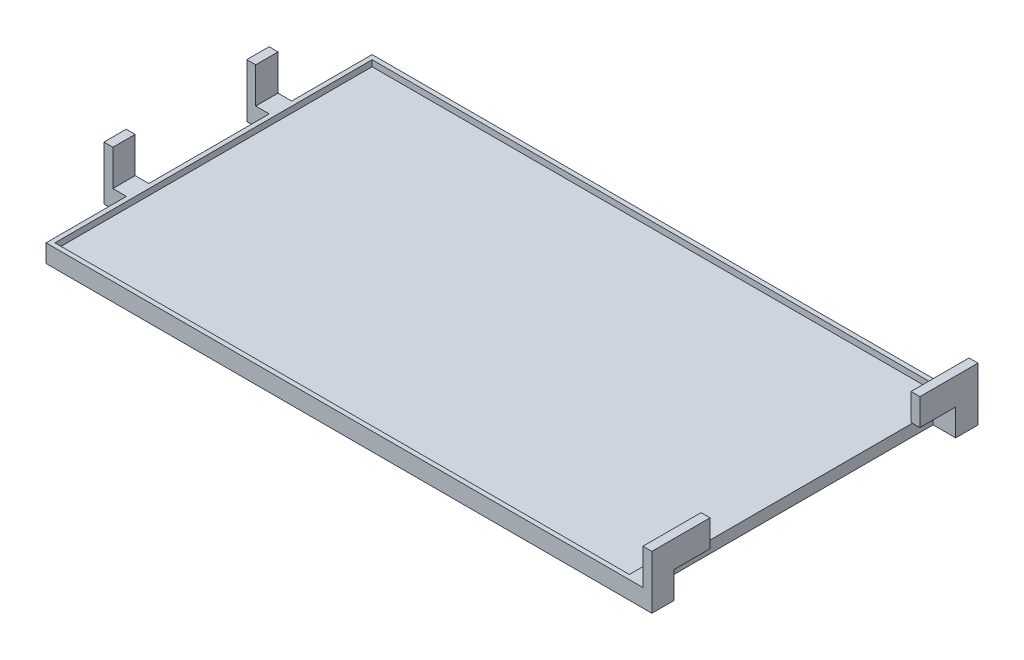
ISO-10303-21;
HEADER;
FILE_DESCRIPTION(('STEP AP214'),'2;1');
FILE_NAME('part.step','',(''),(''),'','','');
FILE_SCHEMA(('AUTOMOTIVE_DESIGN { 1 0 10303 214 1 1 1 1 }'));
ENDSEC;
DATA;
#1=APPLICATION_CONTEXT('core data for automotive mechanical design processes');
#2=APPLICATION_PROTOCOL_DEFINITION('international standard','automotive_design',2000,#1);
#3=PRODUCT_CONTEXT('',#1,'mechanical');
#4=PRODUCT('Part','Part','',(#3));
#5=PRODUCT_RELATED_PRODUCT_CATEGORY('part','',(#4));
#6=PRODUCT_DEFINITION_FORMATION('','',#4);
#7=PRODUCT_DEFINITION_CONTEXT('part definition',#1,'design');
#8=PRODUCT_DEFINITION('design','',#6,#7);
#9=PRODUCT_DEFINITION_SHAPE('','',#8);
#10=(LENGTH_UNIT() NAMED_UNIT(*) SI_UNIT(.MILLI.,.METRE.));
#11=(NAMED_UNIT(*) PLANE_ANGLE_UNIT() SI_UNIT($,.RADIAN.));
#12=(NAMED_UNIT(*) SI_UNIT($,.STERADIAN.) SOLID_ANGLE_UNIT());
#13=UNCERTAINTY_MEASURE_WITH_UNIT(LENGTH_MEASURE(1.E-05),#10,'distance_accuracy_value','');
#14=(GEOMETRIC_REPRESENTATION_CONTEXT(3) GLOBAL_UNCERTAINTY_ASSIGNED_CONTEXT((#13)) GLOBAL_UNIT_ASSIGNED_CONTEXT((#10,
#11,#12)) REPRESENTATION_CONTEXT('',''));
#15=CARTESIAN_POINT('',(0.,0.,0.));
#16=DIRECTION('',(0.,0.,1.));
#17=DIRECTION('',(1.,0.,0.));
#18=AXIS2_PLACEMENT_3D('',#15,#16,#17);
#19=CARTESIAN_POINT('',(0.,4.,0.));
#20=DIRECTION('',(0.,-1.,0.));
#21=DIRECTION('',(0.,0.,-1.));
#22=AXIS2_PLACEMENT_3D('',#19,#20,#21);
#23=PLANE('',#22);
#24=DIRECTION('',(0.,0.,-1.));
#25=VECTOR('',#24,1.);
#26=CARTESIAN_POINT('',(-3.045005,4.,-18.));
#27=LINE('',#26,#25);
#28=CARTESIAN_POINT('',(-3.045005,4.,-18.));
#29=VERTEX_POINT('',#28);
#30=CARTESIAN_POINT('',(-3.045005,4.,-23.));
#31=VERTEX_POINT('',#30);
#32=EDGE_CURVE('E295',#29,#31,#27,.T.);
#33=ORIENTED_EDGE('',*,*,#32,.F.);
#34=DIRECTION('',(-1.,0.,0.));
#35=VECTOR('',#34,1.);
#36=CARTESIAN_POINT('',(0.,4.,-18.));
#37=LINE('',#36,#35);
#38=CARTESIAN_POINT('',(0.,4.,-18.));
#39=VERTEX_POINT('',#38);
#40=EDGE_CURVE('E322',#39,#29,#37,.T.);
#41=ORIENTED_EDGE('',*,*,#40,.F.);
#42=DIRECTION('',(0.,0.,1.));
#43=VECTOR('',#42,1.);
#44=CARTESIAN_POINT('',(0.,4.,0.));
#45=LINE('',#44,#43);
#46=CARTESIAN_POINT('',(0.,4.,0.));
#47=VERTEX_POINT('',#46);
#48=EDGE_CURVE('E48',#39,#47,#45,.T.);
#49=ORIENTED_EDGE('',*,*,#48,.T.);
#50=DIRECTION('',(1.,0.,0.));
#51=VECTOR('',#50,1.);
#52=CARTESIAN_POINT('',(0.,4.,0.));
#53=LINE('',#52,#51);
#54=CARTESIAN_POINT('',(133.555005,4.,0.));
#55=VERTEX_POINT('',#54);
#56=EDGE_CURVE('E517',#47,#55,#53,.T.);
#57=ORIENTED_EDGE('',*,*,#56,.T.);
#58=DIRECTION('',(0.,0.,1.));
#59=VECTOR('',#58,1.);
#60=CARTESIAN_POINT('',(133.555005,4.,-5.));
#61=LINE('',#60,#59);
#62=CARTESIAN_POINT('',(133.555005,4.,-5.));
#63=VERTEX_POINT('',#62);
#64=EDGE_CURVE('E393',#63,#55,#61,.T.);
#65=ORIENTED_EDGE('',*,*,#64,.F.);
#66=DIRECTION('',(1.,0.,0.));
#67=VECTOR('',#66,1.);
#68=CARTESIAN_POINT('',(130.51,4.,-5.));
#69=LINE('',#68,#67);
#70=CARTESIAN_POINT('',(130.51,4.,-5.));
#71=VERTEX_POINT('',#70);
#72=EDGE_CURVE('E423',#71,#63,#69,.T.);
#73=ORIENTED_EDGE('',*,*,#72,.F.);
#74=DIRECTION('',(0.,0.,-1.));
#75=VECTOR('',#74,1.);
#76=CARTESIAN_POINT('',(130.51,4.,0.));
#77=LINE('',#76,#75);
#78=CARTESIAN_POINT('',(130.51,4.,-6.));
#79=VERTEX_POINT('',#78);
#80=EDGE_CURVE('E522',#71,#79,#77,.T.);
#81=ORIENTED_EDGE('',*,*,#80,.T.);
#82=DIRECTION('',(-1.,0.,0.));
#83=VECTOR('',#82,1.);
#84=CARTESIAN_POINT('',(130.51,4.,-6.));
#85=LINE('',#84,#83);
#86=CARTESIAN_POINT('',(129.51,4.,-6.));
#87=VERTEX_POINT('',#86);
#88=EDGE_CURVE('E472',#79,#87,#85,.T.);
#89=ORIENTED_EDGE('',*,*,#88,.T.);
#90=DIRECTION('',(0.,0.,-1.));
#91=VECTOR('',#90,1.);
#92=CARTESIAN_POINT('',(129.51,4.,-1.));
#93=LINE('',#92,#91);
#94=CARTESIAN_POINT('',(129.51,4.,-1.));
#95=VERTEX_POINT('',#94);
#96=EDGE_CURVE('E483',#95,#87,#93,.T.);
#97=ORIENTED_EDGE('',*,*,#96,.F.);
#98=DIRECTION('',(1.,0.,0.));
#99=VECTOR('',#98,1.);
#100=CARTESIAN_POINT('',(1.,4.,-1.));
#101=LINE('',#100,#99);
#102=CARTESIAN_POINT('',(1.,4.,-1.));
#103=VERTEX_POINT('',#102);
#104=EDGE_CURVE('E498',#103,#95,#101,.T.);
#105=ORIENTED_EDGE('',*,*,#104,.F.);
#106=DIRECTION('',(0.,0.,1.));
#107=VECTOR('',#106,1.);
#108=CARTESIAN_POINT('',(1.,4.,-71.96));
#109=LINE('',#108,#107);
#110=CARTESIAN_POINT('',(1.,4.,-71.96));
#111=VERTEX_POINT('',#110);
#112=EDGE_CURVE('E495',#111,#103,#109,.T.);
#113=ORIENTED_EDGE('',*,*,#112,.F.);
#114=DIRECTION('',(-1.,0.,0.));
#115=VECTOR('',#114,1.);
#116=CARTESIAN_POINT('',(129.51,4.,-71.96));
#117=LINE('',#116,#115);
#118=CARTESIAN_POINT('',(129.51,4.,-71.96));
#119=VERTEX_POINT('',#118);
#120=EDGE_CURVE('E471',#119,#111,#117,.T.);
#121=ORIENTED_EDGE('',*,*,#120,.F.);
#122=CARTESIAN_POINT('',(129.51,4.,-66.96));
#123=VERTEX_POINT('',#122);
#124=EDGE_CURVE('E501',#123,#119,#93,.T.);
#125=ORIENTED_EDGE('',*,*,#124,.F.);
#126=DIRECTION('',(-1.,0.,0.));
#127=VECTOR('',#126,1.);
#128=CARTESIAN_POINT('',(130.51,4.,-66.96));
#129=LINE('',#128,#127);
#130=CARTESIAN_POINT('',(130.51,4.,-66.96));
#131=VERTEX_POINT('',#130);
#132=EDGE_CURVE('E469',#131,#123,#129,.T.);
#133=ORIENTED_EDGE('',*,*,#132,.F.);
#134=CARTESIAN_POINT('',(130.51,4.,-67.96));
#135=VERTEX_POINT('',#134);
#136=EDGE_CURVE('E521',#131,#135,#77,.T.);
#137=ORIENTED_EDGE('',*,*,#136,.T.);
#138=DIRECTION('',(-1.,0.,0.));
#139=VECTOR('',#138,1.);
#140=CARTESIAN_POINT('',(130.51,4.,-67.96));
#141=LINE('',#140,#139);
#142=CARTESIAN_POINT('',(133.555005,4.,-67.96));
#143=VERTEX_POINT('',#142);
#144=EDGE_CURVE('E440',#143,#135,#141,.T.);
#145=ORIENTED_EDGE('',*,*,#144,.F.);
#146=DIRECTION('',(0.,0.,1.));
#147=VECTOR('',#146,1.);
#148=CARTESIAN_POINT('',(133.555005,4.,-72.96));
#149=LINE('',#148,#147);
#150=CARTESIAN_POINT('',(133.555005,4.,-72.96));
#151=VERTEX_POINT('',#150);
#152=EDGE_CURVE('E407',#151,#143,#149,.T.);
#153=ORIENTED_EDGE('',*,*,#152,.F.);
#154=DIRECTION('',(-1.,0.,0.));
#155=VECTOR('',#154,1.);
#156=CARTESIAN_POINT('',(0.,4.,-72.96));
#157=LINE('',#156,#155);
#158=CARTESIAN_POINT('',(0.,4.,-72.96));
#159=VERTEX_POINT('',#158);
#160=EDGE_CURVE('E524',#151,#159,#157,.T.);
#161=ORIENTED_EDGE('',*,*,#160,.T.);
#162=CARTESIAN_POINT('',(0.,4.,-54.96));
#163=VERTEX_POINT('',#162);
#164=EDGE_CURVE('E514',#159,#163,#45,.T.);
#165=ORIENTED_EDGE('',*,*,#164,.T.);
#166=DIRECTION('',(1.,0.,0.));
#167=VECTOR('',#166,1.);
#168=CARTESIAN_POINT('',(0.,4.,-54.96));
#169=LINE('',#168,#167);
#170=CARTESIAN_POINT('',(-3.045005,4.,-54.96));
#171=VERTEX_POINT('',#170);
#172=EDGE_CURVE('E338',#171,#163,#169,.T.);
#173=ORIENTED_EDGE('',*,*,#172,.F.);
#174=DIRECTION('',(0.,0.,-1.));
#175=VECTOR('',#174,1.);
#176=CARTESIAN_POINT('',(-3.045005,4.,-49.96));
#177=LINE('',#176,#175);
#178=CARTESIAN_POINT('',(-3.045005,4.,-49.96));
#179=VERTEX_POINT('',#178);
#180=EDGE_CURVE('E304',#179,#171,#177,.T.);
#181=ORIENTED_EDGE('',*,*,#180,.F.);
#182=DIRECTION('',(-1.,0.,0.));
#183=VECTOR('',#182,1.);
#184=CARTESIAN_POINT('',(0.,4.,-49.96));
#185=LINE('',#184,#183);
#186=CARTESIAN_POINT('',(0.,4.,-49.96));
#187=VERTEX_POINT('',#186);
#188=EDGE_CURVE('E335',#187,#179,#185,.T.);
#189=ORIENTED_EDGE('',*,*,#188,.F.);
#190=CARTESIAN_POINT('',(0.,4.,-23.));
#191=VERTEX_POINT('',#190);
#192=EDGE_CURVE('E518',#187,#191,#45,.T.);
#193=ORIENTED_EDGE('',*,*,#192,.T.);
#194=DIRECTION('',(1.,0.,0.));
#195=VECTOR('',#194,1.);
#196=CARTESIAN_POINT('',(0.,4.,-23.));
#197=LINE('',#196,#195);
#198=EDGE_CURVE('E56',#31,#191,#197,.T.);
#199=ORIENTED_EDGE('',*,*,#198,.F.);
#200=EDGE_LOOP('',(#33,#41,#49,#57,#65,#73,#81,#89,#97,#105,#113,#121,#125,#133,#137,#145,#153,
#161,#165,#173,#181,#189,#193,#199));
#201=FACE_BOUND('',#200,.T.);
#202=ADVANCED_FACE('F33',(#201),#23,.F.);
#203=CARTESIAN_POINT('',(0.,4.,0.));
#204=DIRECTION('',(1.,0.,0.));
#205=DIRECTION('',(0.,0.,-1.));
#206=AXIS2_PLACEMENT_3D('',#203,#204,#205);
#207=PLANE('',#206);
#208=DIRECTION('',(0.,0.,1.));
#209=VECTOR('',#208,1.);
#210=CARTESIAN_POINT('',(0.,0.,0.));
#211=LINE('',#210,#209);
#212=CARTESIAN_POINT('',(0.,0.,-49.96));
#213=VERTEX_POINT('',#212);
#214=CARTESIAN_POINT('',(0.,0.,-23.));
#215=VERTEX_POINT('',#214);
#216=EDGE_CURVE('E530',#213,#215,#211,.T.);
#217=ORIENTED_EDGE('',*,*,#216,.T.);
#218=DIRECTION('',(0.,-1.,0.));
#219=VECTOR('',#218,1.);
#220=CARTESIAN_POINT('',(0.,4.,-23.));
#221=LINE('',#220,#219);
#222=EDGE_CURVE('E330',#191,#215,#221,.T.);
#223=ORIENTED_EDGE('',*,*,#222,.F.);
#224=ORIENTED_EDGE('',*,*,#192,.F.);
#225=DIRECTION('',(0.,-1.,0.));
#226=VECTOR('',#225,1.);
#227=CARTESIAN_POINT('',(0.,4.,-49.96));
#228=LINE('',#227,#226);
#229=EDGE_CURVE('E341',#187,#213,#228,.T.);
#230=ORIENTED_EDGE('',*,*,#229,.T.);
#231=EDGE_LOOP('',(#217,#223,#224,#230));
#232=FACE_BOUND('',#231,.T.);
#233=ADVANCED_FACE('F631',(#232),#207,.F.);
#234=DIRECTION('',(0.,-1.,0.));
#235=VECTOR('',#234,1.);
#236=CARTESIAN_POINT('',(0.,4.,-54.96));
#237=LINE('',#236,#235);
#238=CARTESIAN_POINT('',(0.,0.,-54.96));
#239=VERTEX_POINT('',#238);
#240=EDGE_CURVE('E349',#163,#239,#237,.T.);
#241=ORIENTED_EDGE('',*,*,#240,.F.);
#242=ORIENTED_EDGE('',*,*,#164,.F.);
#243=DIRECTION('',(0.,-1.,0.));
#244=VECTOR('',#243,1.);
#245=CARTESIAN_POINT('',(0.,4.,-72.96));
#246=LINE('',#245,#244);
#247=CARTESIAN_POINT('',(0.,0.,-72.96));
#248=VERTEX_POINT('',#247);
#249=EDGE_CURVE('E41',#159,#248,#246,.T.);
#250=ORIENTED_EDGE('',*,*,#249,.T.);
#251=EDGE_CURVE('E526',#248,#239,#211,.T.);
#252=ORIENTED_EDGE('',*,*,#251,.T.);
#253=EDGE_LOOP('',(#241,#242,#250,#252));
#254=FACE_BOUND('',#253,.T.);
#255=ADVANCED_FACE('F541',(#254),#207,.F.);
#256=CARTESIAN_POINT('',(130.51,4.,-67.96));
#257=DIRECTION('',(0.,0.,1.));
#258=DIRECTION('',(1.,0.,0.));
#259=AXIS2_PLACEMENT_3D('',#256,#257,#258);
#260=PLANE('',#259);
#261=DIRECTION('',(0.,-1.,0.));
#262=VECTOR('',#261,1.);
#263=CARTESIAN_POINT('',(135.555005,4.,-67.96));
#264=LINE('',#263,#262);
#265=CARTESIAN_POINT('',(135.555005,6.,-67.96));
#266=VERTEX_POINT('',#265);
#267=CARTESIAN_POINT('',(135.555005,0.,-67.96));
#268=VERTEX_POINT('',#267);
#269=EDGE_CURVE('E452',#266,#268,#264,.T.);
#270=ORIENTED_EDGE('',*,*,#269,.F.);
#271=DIRECTION('',(1.,0.,0.));
#272=VECTOR('',#271,1.);
#273=CARTESIAN_POINT('',(133.555005,6.,-67.96));
#274=LINE('',#273,#272);
#275=CARTESIAN_POINT('',(133.555005,6.,-67.96));
#276=VERTEX_POINT('',#275);
#277=EDGE_CURVE('E351',#276,#266,#274,.T.);
#278=ORIENTED_EDGE('',*,*,#277,.F.);
#279=DIRECTION('',(0.,-1.,0.));
#280=VECTOR('',#279,1.);
#281=CARTESIAN_POINT('',(133.555005,12.,-67.96));
#282=LINE('',#281,#280);
#283=EDGE_CURVE('E415',#276,#143,#282,.T.);
#284=ORIENTED_EDGE('',*,*,#283,.T.);
#285=ORIENTED_EDGE('',*,*,#144,.T.);
#286=DIRECTION('',(0.,-1.,0.));
#287=VECTOR('',#286,1.);
#288=CARTESIAN_POINT('',(130.51,4.,-67.96));
#289=LINE('',#288,#287);
#290=CARTESIAN_POINT('',(130.51,0.,-67.96));
#291=VERTEX_POINT('',#290);
#292=EDGE_CURVE('E448',#135,#291,#289,.T.);
#293=ORIENTED_EDGE('',*,*,#292,.T.);
#294=DIRECTION('',(-1.,0.,0.));
#295=VECTOR('',#294,1.);
#296=CARTESIAN_POINT('',(130.51,0.,-67.96));
#297=LINE('',#296,#295);
#298=EDGE_CURVE('E443',#268,#291,#297,.T.);
#299=ORIENTED_EDGE('',*,*,#298,.F.);
#300=EDGE_LOOP('',(#270,#278,#284,#285,#293,#299));
#301=FACE_BOUND('',#300,.T.);
#302=ADVANCED_FACE('F578',(#301),#260,.T.);
#303=CARTESIAN_POINT('',(130.51,4.,-5.));
#304=DIRECTION('',(0.,0.,-1.));
#305=DIRECTION('',(-1.,0.,0.));
#306=AXIS2_PLACEMENT_3D('',#303,#304,#305);
#307=PLANE('',#306);
#308=DIRECTION('',(0.,-1.,0.));
#309=VECTOR('',#308,1.);
#310=CARTESIAN_POINT('',(133.555005,12.,-5.));
#311=LINE('',#310,#309);
#312=CARTESIAN_POINT('',(133.555005,6.,-5.));
#313=VERTEX_POINT('',#312);
#314=EDGE_CURVE('E405',#313,#63,#311,.T.);
#315=ORIENTED_EDGE('',*,*,#314,.F.);
#316=DIRECTION('',(-1.,0.,0.));
#317=VECTOR('',#316,1.);
#318=CARTESIAN_POINT('',(135.555005,6.,-5.));
#319=LINE('',#318,#317);
#320=CARTESIAN_POINT('',(135.555005,6.,-5.));
#321=VERTEX_POINT('',#320);
#322=EDGE_CURVE('E375',#321,#313,#319,.T.);
#323=ORIENTED_EDGE('',*,*,#322,.F.);
#324=DIRECTION('',(0.,-1.,0.));
#325=VECTOR('',#324,1.);
#326=CARTESIAN_POINT('',(135.555005,4.,-5.));
#327=LINE('',#326,#325);
#328=CARTESIAN_POINT('',(135.555005,0.,-5.));
#329=VERTEX_POINT('',#328);
#330=EDGE_CURVE('E436',#321,#329,#327,.T.);
#331=ORIENTED_EDGE('',*,*,#330,.T.);
#332=DIRECTION('',(1.,0.,0.));
#333=VECTOR('',#332,1.);
#334=CARTESIAN_POINT('',(130.51,0.,-5.));
#335=LINE('',#334,#333);
#336=CARTESIAN_POINT('',(130.51,0.,-5.));
#337=VERTEX_POINT('',#336);
#338=EDGE_CURVE('E422',#337,#329,#335,.T.);
#339=ORIENTED_EDGE('',*,*,#338,.F.);
#340=DIRECTION('',(0.,-1.,0.));
#341=VECTOR('',#340,1.);
#342=CARTESIAN_POINT('',(130.51,4.,-5.));
#343=LINE('',#342,#341);
#344=EDGE_CURVE('E426',#71,#337,#343,.T.);
#345=ORIENTED_EDGE('',*,*,#344,.F.);
#346=ORIENTED_EDGE('',*,*,#72,.T.);
#347=EDGE_LOOP('',(#315,#323,#331,#339,#345,#346));
#348=FACE_BOUND('',#347,.T.);
#349=ADVANCED_FACE('F641',(#348),#307,.T.);
#350=CARTESIAN_POINT('',(130.51,4.,0.));
#351=DIRECTION('',(-1.,0.,0.));
#352=DIRECTION('',(0.,0.,1.));
#353=AXIS2_PLACEMENT_3D('',#350,#351,#352);
#354=PLANE('',#353);
#355=ORIENTED_EDGE('',*,*,#80,.F.);
#356=ORIENTED_EDGE('',*,*,#344,.T.);
#357=DIRECTION('',(0.,0.,-1.));
#358=VECTOR('',#357,1.);
#359=CARTESIAN_POINT('',(130.51,0.,0.));
#360=LINE('',#359,#358);
#361=EDGE_CURVE('E532',#337,#291,#360,.T.);
#362=ORIENTED_EDGE('',*,*,#361,.T.);
#363=ORIENTED_EDGE('',*,*,#292,.F.);
#364=ORIENTED_EDGE('',*,*,#136,.F.);
#365=DIRECTION('',(0.,-1.,0.));
#366=VECTOR('',#365,1.);
#367=CARTESIAN_POINT('',(130.51,4.,-66.96));
#368=LINE('',#367,#366);
#369=CARTESIAN_POINT('',(130.51,2.64,-66.96));
#370=VERTEX_POINT('',#369);
#371=EDGE_CURVE('E456',#131,#370,#368,.T.);
#372=ORIENTED_EDGE('',*,*,#371,.T.);
#373=DIRECTION('',(0.,0.,1.));
#374=VECTOR('',#373,1.);
#375=CARTESIAN_POINT('',(130.51,2.64,-66.96));
#376=LINE('',#375,#374);
#377=CARTESIAN_POINT('',(130.51,2.64,-6.));
#378=VERTEX_POINT('',#377);
#379=EDGE_CURVE('E459',#370,#378,#376,.T.);
#380=ORIENTED_EDGE('',*,*,#379,.T.);
#381=DIRECTION('',(0.,1.,0.));
#382=VECTOR('',#381,1.);
#383=CARTESIAN_POINT('',(130.51,4.,-6.));
#384=LINE('',#383,#382);
#385=EDGE_CURVE('E463',#378,#79,#384,.T.);
#386=ORIENTED_EDGE('',*,*,#385,.T.);
#387=EDGE_LOOP('',(#355,#356,#362,#363,#364,#372,#380,#386));
#388=FACE_BOUND('',#387,.T.);
#389=ADVANCED_FACE('F584',(#388),#354,.F.);
#390=CARTESIAN_POINT('',(129.51,2.64,-1.));
#391=DIRECTION('',(1.,0.,0.));
#392=DIRECTION('',(0.,0.,-1.));
#393=AXIS2_PLACEMENT_3D('',#390,#391,#392);
#394=PLANE('',#393);
#395=DIRECTION('',(0.,0.,-1.));
#396=VECTOR('',#395,1.);
#397=CARTESIAN_POINT('',(129.51,2.64,-1.));
#398=LINE('',#397,#396);
#399=CARTESIAN_POINT('',(129.51,2.64,-66.96));
#400=VERTEX_POINT('',#399);
#401=CARTESIAN_POINT('',(129.51,2.64,-71.96));
#402=VERTEX_POINT('',#401);
#403=EDGE_CURVE('E489',#400,#402,#398,.T.);
#404=ORIENTED_EDGE('',*,*,#403,.F.);
#405=DIRECTION('',(0.,-1.,0.));
#406=VECTOR('',#405,1.);
#407=CARTESIAN_POINT('',(129.51,4.,-66.96));
#408=LINE('',#407,#406);
#409=EDGE_CURVE('E451',#123,#400,#408,.T.);
#410=ORIENTED_EDGE('',*,*,#409,.F.);
#411=ORIENTED_EDGE('',*,*,#124,.T.);
#412=DIRECTION('',(0.,1.,0.));
#413=VECTOR('',#412,1.);
#414=CARTESIAN_POINT('',(129.51,2.64,-71.96));
#415=LINE('',#414,#413);
#416=EDGE_CURVE('E504',#402,#119,#415,.T.);
#417=ORIENTED_EDGE('',*,*,#416,.F.);
#418=EDGE_LOOP('',(#404,#410,#411,#417));
#419=FACE_BOUND('',#418,.T.);
#420=ADVANCED_FACE('F593',(#419),#394,.F.);
#421=ORIENTED_EDGE('',*,*,#48,.F.);
#422=DIRECTION('',(0.,-1.,0.));
#423=VECTOR('',#422,1.);
#424=CARTESIAN_POINT('',(0.,4.,-18.));
#425=LINE('',#424,#423);
#426=CARTESIAN_POINT('',(0.,0.,-18.));
#427=VERTEX_POINT('',#426);
#428=EDGE_CURVE('E280',#39,#427,#425,.T.);
#429=ORIENTED_EDGE('',*,*,#428,.T.);
#430=CARTESIAN_POINT('',(0.,0.,0.));
#431=VERTEX_POINT('',#430);
#432=EDGE_CURVE('E507',#427,#431,#211,.T.);
#433=ORIENTED_EDGE('',*,*,#432,.T.);
#434=DIRECTION('',(0.,-1.,0.));
#435=VECTOR('',#434,1.);
#436=CARTESIAN_POINT('',(0.,4.,0.));
#437=LINE('',#436,#435);
#438=EDGE_CURVE('E11',#47,#431,#437,.T.);
#439=ORIENTED_EDGE('',*,*,#438,.F.);
#440=EDGE_LOOP('',(#421,#429,#433,#439));
#441=FACE_BOUND('',#440,.T.);
#442=ADVANCED_FACE('F35',(#441),#207,.F.);
#443=CARTESIAN_POINT('',(0.,4.,0.));
#444=DIRECTION('',(0.,0.,-1.));
#445=DIRECTION('',(-1.,0.,0.));
#446=AXIS2_PLACEMENT_3D('',#443,#444,#445);
#447=PLANE('',#446);
#448=DIRECTION('',(1.,0.,0.));
#449=VECTOR('',#448,1.);
#450=CARTESIAN_POINT('',(0.,0.,0.));
#451=LINE('',#450,#449);
#452=CARTESIAN_POINT('',(135.555005,0.,0.));
#453=VERTEX_POINT('',#452);
#454=EDGE_CURVE('E529',#431,#453,#451,.T.);
#455=ORIENTED_EDGE('',*,*,#454,.T.);
#456=DIRECTION('',(0.,-1.,0.));
#457=VECTOR('',#456,1.);
#458=CARTESIAN_POINT('',(135.555005,4.,0.));
#459=LINE('',#458,#457);
#460=CARTESIAN_POINT('',(135.555005,12.,0.));
#461=VERTEX_POINT('',#460);
#462=EDGE_CURVE('E432',#461,#453,#459,.T.);
#463=ORIENTED_EDGE('',*,*,#462,.F.);
#464=DIRECTION('',(1.,0.,0.));
#465=VECTOR('',#464,1.);
#466=CARTESIAN_POINT('',(135.555005,12.,0.));
#467=LINE('',#466,#465);
#468=CARTESIAN_POINT('',(133.555005,12.,0.));
#469=VERTEX_POINT('',#468);
#470=EDGE_CURVE('E398',#469,#461,#467,.T.);
#471=ORIENTED_EDGE('',*,*,#470,.F.);
#472=DIRECTION('',(0.,-1.,0.));
#473=VECTOR('',#472,1.);
#474=CARTESIAN_POINT('',(133.555005,12.,0.));
#475=LINE('',#474,#473);
#476=EDGE_CURVE('E401',#469,#55,#475,.T.);
#477=ORIENTED_EDGE('',*,*,#476,.T.);
#478=ORIENTED_EDGE('',*,*,#56,.F.);
#479=ORIENTED_EDGE('',*,*,#438,.T.);
#480=EDGE_LOOP('',(#455,#463,#471,#477,#478,#479));
#481=FACE_BOUND('',#480,.T.);
#482=ADVANCED_FACE('F639',(#481),#447,.F.);
#483=CARTESIAN_POINT('',(0.,4.,-72.96));
#484=DIRECTION('',(0.,0.,1.));
#485=DIRECTION('',(1.,0.,0.));
#486=AXIS2_PLACEMENT_3D('',#483,#484,#485);
#487=PLANE('',#486);
#488=DIRECTION('',(-1.,0.,0.));
#489=VECTOR('',#488,1.);
#490=CARTESIAN_POINT('',(0.,0.,-72.96));
#491=LINE('',#490,#489);
#492=CARTESIAN_POINT('',(135.555005,0.,-72.96));
#493=VERTEX_POINT('',#492);
#494=EDGE_CURVE('E534',#493,#248,#491,.T.);
#495=ORIENTED_EDGE('',*,*,#494,.T.);
#496=ORIENTED_EDGE('',*,*,#249,.F.);
#497=ORIENTED_EDGE('',*,*,#160,.F.);
#498=DIRECTION('',(0.,-1.,0.));
#499=VECTOR('',#498,1.);
#500=CARTESIAN_POINT('',(133.555005,12.,-72.96));
#501=LINE('',#500,#499);
#502=CARTESIAN_POINT('',(133.555005,12.,-72.96));
#503=VERTEX_POINT('',#502);
#504=EDGE_CURVE('E419',#503,#151,#501,.T.);
#505=ORIENTED_EDGE('',*,*,#504,.F.);
#506=DIRECTION('',(-1.,0.,0.));
#507=VECTOR('',#506,1.);
#508=CARTESIAN_POINT('',(135.555005,12.,-72.96));
#509=LINE('',#508,#507);
#510=CARTESIAN_POINT('',(135.555005,12.,-72.96));
#511=VERTEX_POINT('',#510);
#512=EDGE_CURVE('E411',#511,#503,#509,.T.);
#513=ORIENTED_EDGE('',*,*,#512,.F.);
#514=DIRECTION('',(0.,-1.,0.));
#515=VECTOR('',#514,1.);
#516=CARTESIAN_POINT('',(135.555005,4.,-72.96));
#517=LINE('',#516,#515);
#518=EDGE_CURVE('E442',#511,#493,#517,.T.);
#519=ORIENTED_EDGE('',*,*,#518,.T.);
#520=EDGE_LOOP('',(#495,#496,#497,#505,#513,#519));
#521=FACE_BOUND('',#520,.T.);
#522=ADVANCED_FACE('F557',(#521),#487,.F.);
#523=CARTESIAN_POINT('',(0.,0.,0.));
#524=DIRECTION('',(0.,-1.,0.));
#525=DIRECTION('',(0.,0.,-1.));
#526=AXIS2_PLACEMENT_3D('',#523,#524,#525);
#527=PLANE('',#526);
#528=ORIENTED_EDGE('',*,*,#251,.F.);
#529=ORIENTED_EDGE('',*,*,#494,.F.);
#530=DIRECTION('',(0.,0.,1.));
#531=VECTOR('',#530,1.);
#532=CARTESIAN_POINT('',(135.555005,0.,-72.96));
#533=LINE('',#532,#531);
#534=EDGE_CURVE('E435',#493,#268,#533,.T.);
#535=ORIENTED_EDGE('',*,*,#534,.T.);
#536=ORIENTED_EDGE('',*,*,#298,.T.);
#537=ORIENTED_EDGE('',*,*,#361,.F.);
#538=ORIENTED_EDGE('',*,*,#338,.T.);
#539=DIRECTION('',(0.,0.,1.));
#540=VECTOR('',#539,1.);
#541=CARTESIAN_POINT('',(135.555005,0.,0.));
#542=LINE('',#541,#540);
#543=EDGE_CURVE('E427',#329,#453,#542,.T.);
#544=ORIENTED_EDGE('',*,*,#543,.T.);
#545=ORIENTED_EDGE('',*,*,#454,.F.);
#546=ORIENTED_EDGE('',*,*,#432,.F.);
#547=DIRECTION('',(-1.,0.,0.));
#548=VECTOR('',#547,1.);
#549=CARTESIAN_POINT('',(0.,0.,-18.));
#550=LINE('',#549,#548);
#551=CARTESIAN_POINT('',(-5.045005,0.,-18.));
#552=VERTEX_POINT('',#551);
#553=EDGE_CURVE('E321',#427,#552,#550,.T.);
#554=ORIENTED_EDGE('',*,*,#553,.T.);
#555=DIRECTION('',(0.,0.,-1.));
#556=VECTOR('',#555,1.);
#557=CARTESIAN_POINT('',(-5.045005,0.,-23.));
#558=LINE('',#557,#556);
#559=CARTESIAN_POINT('',(-5.045005,0.,-23.));
#560=VERTEX_POINT('',#559);
#561=EDGE_CURVE('E275',#552,#560,#558,.T.);
#562=ORIENTED_EDGE('',*,*,#561,.T.);
#563=DIRECTION('',(1.,0.,0.));
#564=VECTOR('',#563,1.);
#565=CARTESIAN_POINT('',(0.,0.,-23.));
#566=LINE('',#565,#564);
#567=EDGE_CURVE('E324',#560,#215,#566,.T.);
#568=ORIENTED_EDGE('',*,*,#567,.T.);
#569=ORIENTED_EDGE('',*,*,#216,.F.);
#570=DIRECTION('',(-1.,0.,0.));
#571=VECTOR('',#570,1.);
#572=CARTESIAN_POINT('',(0.,0.,-49.96));
#573=LINE('',#572,#571);
#574=CARTESIAN_POINT('',(-5.045005,0.,-49.96));
#575=VERTEX_POINT('',#574);
#576=EDGE_CURVE('E332',#213,#575,#573,.T.);
#577=ORIENTED_EDGE('',*,*,#576,.T.);
#578=DIRECTION('',(0.,0.,-1.));
#579=VECTOR('',#578,1.);
#580=CARTESIAN_POINT('',(-5.045005,0.,-54.96));
#581=LINE('',#580,#579);
#582=CARTESIAN_POINT('',(-5.045005,0.,-54.96));
#583=VERTEX_POINT('',#582);
#584=EDGE_CURVE('E344',#575,#583,#581,.T.);
#585=ORIENTED_EDGE('',*,*,#584,.T.);
#586=DIRECTION('',(1.,0.,0.));
#587=VECTOR('',#586,1.);
#588=CARTESIAN_POINT('',(0.,0.,-54.96));
#589=LINE('',#588,#587);
#590=EDGE_CURVE('E339',#583,#239,#589,.T.);
#591=ORIENTED_EDGE('',*,*,#590,.T.);
#592=EDGE_LOOP('',(#528,#529,#535,#536,#537,#538,#544,#545,#546,#554,#562,#568,#569,#577,#585,#591));
#593=FACE_BOUND('',#592,.T.);
#594=ADVANCED_FACE('F545',(#593),#527,.T.);
#595=CARTESIAN_POINT('',(129.51,2.64,-71.96));
#596=DIRECTION('',(0.,0.,-1.));
#597=DIRECTION('',(-1.,0.,0.));
#598=AXIS2_PLACEMENT_3D('',#595,#596,#597);
#599=PLANE('',#598);
#600=ORIENTED_EDGE('',*,*,#120,.T.);
#601=DIRECTION('',(0.,1.,0.));
#602=VECTOR('',#601,1.);
#603=CARTESIAN_POINT('',(1.,2.64,-71.96));
#604=LINE('',#603,#602);
#605=CARTESIAN_POINT('',(1.,2.64,-71.96));
#606=VERTEX_POINT('',#605);
#607=EDGE_CURVE('E493',#606,#111,#604,.T.);
#608=ORIENTED_EDGE('',*,*,#607,.F.);
#609=DIRECTION('',(-1.,0.,0.));
#610=VECTOR('',#609,1.);
#611=CARTESIAN_POINT('',(129.51,2.64,-71.96));
#612=LINE('',#611,#610);
#613=EDGE_CURVE('E479',#402,#606,#612,.T.);
#614=ORIENTED_EDGE('',*,*,#613,.F.);
#615=ORIENTED_EDGE('',*,*,#416,.T.);
#616=EDGE_LOOP('',(#600,#608,#614,#615));
#617=FACE_BOUND('',#616,.T.);
#618=ADVANCED_FACE('F619',(#617),#599,.F.);
#619=ORIENTED_EDGE('',*,*,#96,.T.);
#620=DIRECTION('',(0.,1.,0.));
#621=VECTOR('',#620,1.);
#622=CARTESIAN_POINT('',(129.51,4.,-6.));
#623=LINE('',#622,#621);
#624=CARTESIAN_POINT('',(129.51,2.64,-6.));
#625=VERTEX_POINT('',#624);
#626=EDGE_CURVE('E460',#625,#87,#623,.T.);
#627=ORIENTED_EDGE('',*,*,#626,.F.);
#628=CARTESIAN_POINT('',(129.51,2.64,-1.));
#629=VERTEX_POINT('',#628);
#630=EDGE_CURVE('E490',#629,#625,#398,.T.);
#631=ORIENTED_EDGE('',*,*,#630,.F.);
#632=DIRECTION('',(0.,1.,0.));
#633=VECTOR('',#632,1.);
#634=CARTESIAN_POINT('',(129.51,2.64,-1.));
#635=LINE('',#634,#633);
#636=EDGE_CURVE('E508',#629,#95,#635,.T.);
#637=ORIENTED_EDGE('',*,*,#636,.T.);
#638=EDGE_LOOP('',(#619,#627,#631,#637));
#639=FACE_BOUND('',#638,.T.);
#640=ADVANCED_FACE('F609',(#639),#394,.F.);
#641=CARTESIAN_POINT('',(1.,2.64,-1.));
#642=DIRECTION('',(0.,0.,1.));
#643=DIRECTION('',(1.,0.,0.));
#644=AXIS2_PLACEMENT_3D('',#641,#642,#643);
#645=PLANE('',#644);
#646=ORIENTED_EDGE('',*,*,#104,.T.);
#647=ORIENTED_EDGE('',*,*,#636,.F.);
#648=DIRECTION('',(1.,0.,0.));
#649=VECTOR('',#648,1.);
#650=CARTESIAN_POINT('',(1.,2.64,-1.));
#651=LINE('',#650,#649);
#652=CARTESIAN_POINT('',(1.,2.64,-1.));
#653=VERTEX_POINT('',#652);
#654=EDGE_CURVE('E486',#653,#629,#651,.T.);
#655=ORIENTED_EDGE('',*,*,#654,.F.);
#656=DIRECTION('',(0.,1.,0.));
#657=VECTOR('',#656,1.);
#658=CARTESIAN_POINT('',(1.,2.64,-1.));
#659=LINE('',#658,#657);
#660=EDGE_CURVE('E510',#653,#103,#659,.T.);
#661=ORIENTED_EDGE('',*,*,#660,.T.);
#662=EDGE_LOOP('',(#646,#647,#655,#661));
#663=FACE_BOUND('',#662,.T.);
#664=ADVANCED_FACE('F613',(#663),#645,.F.);
#665=CARTESIAN_POINT('',(1.,2.64,-71.96));
#666=DIRECTION('',(-1.,0.,0.));
#667=DIRECTION('',(0.,0.,1.));
#668=AXIS2_PLACEMENT_3D('',#665,#666,#667);
#669=PLANE('',#668);
#670=ORIENTED_EDGE('',*,*,#112,.T.);
#671=ORIENTED_EDGE('',*,*,#660,.F.);
#672=DIRECTION('',(0.,0.,1.));
#673=VECTOR('',#672,1.);
#674=CARTESIAN_POINT('',(1.,2.64,-71.96));
#675=LINE('',#674,#673);
#676=EDGE_CURVE('E482',#606,#653,#675,.T.);
#677=ORIENTED_EDGE('',*,*,#676,.F.);
#678=ORIENTED_EDGE('',*,*,#607,.T.);
#679=EDGE_LOOP('',(#670,#671,#677,#678));
#680=FACE_BOUND('',#679,.T.);
#681=ADVANCED_FACE('F616',(#680),#669,.F.);
#682=CARTESIAN_POINT('',(0.,2.64,0.));
#683=DIRECTION('',(0.,1.,0.));
#684=DIRECTION('',(0.,0.,1.));
#685=AXIS2_PLACEMENT_3D('',#682,#683,#684);
#686=PLANE('',#685);
#687=ORIENTED_EDGE('',*,*,#613,.T.);
#688=ORIENTED_EDGE('',*,*,#676,.T.);
#689=ORIENTED_EDGE('',*,*,#654,.T.);
#690=ORIENTED_EDGE('',*,*,#630,.T.);
#691=DIRECTION('',(-1.,0.,0.));
#692=VECTOR('',#691,1.);
#693=CARTESIAN_POINT('',(130.51,2.64,-6.));
#694=LINE('',#693,#692);
#695=EDGE_CURVE('E475',#378,#625,#694,.T.);
#696=ORIENTED_EDGE('',*,*,#695,.F.);
#697=ORIENTED_EDGE('',*,*,#379,.F.);
#698=DIRECTION('',(-1.,0.,0.));
#699=VECTOR('',#698,1.);
#700=CARTESIAN_POINT('',(130.51,2.64,-66.96));
#701=LINE('',#700,#699);
#702=EDGE_CURVE('E466',#370,#400,#701,.T.);
#703=ORIENTED_EDGE('',*,*,#702,.T.);
#704=ORIENTED_EDGE('',*,*,#403,.T.);
#705=EDGE_LOOP('',(#687,#688,#689,#690,#696,#697,#703,#704));
#706=FACE_BOUND('',#705,.T.);
#707=ADVANCED_FACE('F597',(#706),#686,.T.);
#708=CARTESIAN_POINT('',(130.51,4.,-66.96));
#709=DIRECTION('',(0.,0.,-1.));
#710=DIRECTION('',(-1.,0.,0.));
#711=AXIS2_PLACEMENT_3D('',#708,#709,#710);
#712=PLANE('',#711);
#713=ORIENTED_EDGE('',*,*,#409,.T.);
#714=ORIENTED_EDGE('',*,*,#702,.F.);
#715=ORIENTED_EDGE('',*,*,#371,.F.);
#716=ORIENTED_EDGE('',*,*,#132,.T.);
#717=EDGE_LOOP('',(#713,#714,#715,#716));
#718=FACE_BOUND('',#717,.T.);
#719=ADVANCED_FACE('F590',(#718),#712,.F.);
#720=CARTESIAN_POINT('',(130.51,4.,-6.));
#721=DIRECTION('',(0.,0.,1.));
#722=DIRECTION('',(0.,-1.,0.));
#723=AXIS2_PLACEMENT_3D('',#720,#721,#722);
#724=PLANE('',#723);
#725=ORIENTED_EDGE('',*,*,#626,.T.);
#726=ORIENTED_EDGE('',*,*,#88,.F.);
#727=ORIENTED_EDGE('',*,*,#385,.F.);
#728=ORIENTED_EDGE('',*,*,#695,.T.);
#729=EDGE_LOOP('',(#725,#726,#727,#728));
#730=FACE_BOUND('',#729,.T.);
#731=ADVANCED_FACE('F603',(#730),#724,.F.);
#732=CARTESIAN_POINT('',(135.555005,4.,-72.96));
#733=DIRECTION('',(1.,0.,0.));
#734=DIRECTION('',(0.,0.,-1.));
#735=AXIS2_PLACEMENT_3D('',#732,#733,#734);
#736=PLANE('',#735);
#737=ORIENTED_EDGE('',*,*,#534,.F.);
#738=ORIENTED_EDGE('',*,*,#518,.F.);
#739=DIRECTION('',(0.,0.,-1.));
#740=VECTOR('',#739,1.);
#741=CARTESIAN_POINT('',(135.555005,12.,-72.96));
#742=LINE('',#741,#740);
#743=CARTESIAN_POINT('',(135.555005,12.,-59.96));
#744=VERTEX_POINT('',#743);
#745=EDGE_CURVE('E408',#744,#511,#742,.T.);
#746=ORIENTED_EDGE('',*,*,#745,.F.);
#747=DIRECTION('',(0.,1.,0.));
#748=VECTOR('',#747,1.);
#749=CARTESIAN_POINT('',(135.555005,12.,-59.96));
#750=LINE('',#749,#748);
#751=CARTESIAN_POINT('',(135.555005,6.,-59.96));
#752=VERTEX_POINT('',#751);
#753=EDGE_CURVE('E363',#752,#744,#750,.T.);
#754=ORIENTED_EDGE('',*,*,#753,.F.);
#755=DIRECTION('',(0.,0.,-1.));
#756=VECTOR('',#755,1.);
#757=CARTESIAN_POINT('',(135.555005,6.,-59.96));
#758=LINE('',#757,#756);
#759=EDGE_CURVE('E369',#752,#266,#758,.T.);
#760=ORIENTED_EDGE('',*,*,#759,.T.);
#761=ORIENTED_EDGE('',*,*,#269,.T.);
#762=EDGE_LOOP('',(#737,#738,#746,#754,#760,#761));
#763=FACE_BOUND('',#762,.T.);
#764=ADVANCED_FACE('F574',(#763),#736,.T.);
#765=CARTESIAN_POINT('',(135.555005,4.,0.));
#766=DIRECTION('',(1.,0.,0.));
#767=DIRECTION('',(0.,0.,-1.));
#768=AXIS2_PLACEMENT_3D('',#765,#766,#767);
#769=PLANE('',#768);
#770=ORIENTED_EDGE('',*,*,#543,.F.);
#771=ORIENTED_EDGE('',*,*,#330,.F.);
#772=DIRECTION('',(0.,0.,1.));
#773=VECTOR('',#772,1.);
#774=CARTESIAN_POINT('',(135.555005,6.,-13.));
#775=LINE('',#774,#773);
#776=CARTESIAN_POINT('',(135.555005,6.,-13.));
#777=VERTEX_POINT('',#776);
#778=EDGE_CURVE('E391',#777,#321,#775,.T.);
#779=ORIENTED_EDGE('',*,*,#778,.F.);
#780=DIRECTION('',(0.,-1.,0.));
#781=VECTOR('',#780,1.);
#782=CARTESIAN_POINT('',(135.555005,12.,-13.));
#783=LINE('',#782,#781);
#784=CARTESIAN_POINT('',(135.555005,12.,-13.));
#785=VERTEX_POINT('',#784);
#786=EDGE_CURVE('E376',#785,#777,#783,.T.);
#787=ORIENTED_EDGE('',*,*,#786,.F.);
#788=DIRECTION('',(0.,0.,-1.));
#789=VECTOR('',#788,1.);
#790=CARTESIAN_POINT('',(135.555005,12.,-5.));
#791=LINE('',#790,#789);
#792=EDGE_CURVE('E394',#461,#785,#791,.T.);
#793=ORIENTED_EDGE('',*,*,#792,.F.);
#794=ORIENTED_EDGE('',*,*,#462,.T.);
#795=EDGE_LOOP('',(#770,#771,#779,#787,#793,#794));
#796=FACE_BOUND('',#795,.T.);
#797=ADVANCED_FACE('F653',(#796),#769,.T.);
#798=CARTESIAN_POINT('',(133.555005,12.,-72.96));
#799=DIRECTION('',(1.,0.,0.));
#800=DIRECTION('',(0.,0.,-1.));
#801=AXIS2_PLACEMENT_3D('',#798,#799,#800);
#802=PLANE('',#801);
#803=ORIENTED_EDGE('',*,*,#152,.T.);
#804=ORIENTED_EDGE('',*,*,#283,.F.);
#805=DIRECTION('',(0.,0.,-1.));
#806=VECTOR('',#805,1.);
#807=CARTESIAN_POINT('',(133.555005,6.,-59.96));
#808=LINE('',#807,#806);
#809=CARTESIAN_POINT('',(133.555005,6.,-59.96));
#810=VERTEX_POINT('',#809);
#811=EDGE_CURVE('E373',#810,#276,#808,.T.);
#812=ORIENTED_EDGE('',*,*,#811,.F.);
#813=DIRECTION('',(0.,-1.,0.));
#814=VECTOR('',#813,1.);
#815=CARTESIAN_POINT('',(133.555005,12.,-59.96));
#816=LINE('',#815,#814);
#817=CARTESIAN_POINT('',(133.555005,12.,-59.96));
#818=VERTEX_POINT('',#817);
#819=EDGE_CURVE('E358',#818,#810,#816,.T.);
#820=ORIENTED_EDGE('',*,*,#819,.F.);
#821=DIRECTION('',(0.,0.,1.));
#822=VECTOR('',#821,1.);
#823=CARTESIAN_POINT('',(133.555005,12.,-72.96));
#824=LINE('',#823,#822);
#825=EDGE_CURVE('E413',#503,#818,#824,.T.);
#826=ORIENTED_EDGE('',*,*,#825,.F.);
#827=ORIENTED_EDGE('',*,*,#504,.T.);
#828=EDGE_LOOP('',(#803,#804,#812,#820,#826,#827));
#829=FACE_BOUND('',#828,.T.);
#830=ADVANCED_FACE('F561',(#829),#802,.F.);
#831=CARTESIAN_POINT('',(0.,12.,0.));
#832=DIRECTION('',(0.,-1.,0.));
#833=DIRECTION('',(0.,0.,-1.));
#834=AXIS2_PLACEMENT_3D('',#831,#832,#833);
#835=PLANE('',#834);
#836=ORIENTED_EDGE('',*,*,#745,.T.);
#837=ORIENTED_EDGE('',*,*,#512,.T.);
#838=ORIENTED_EDGE('',*,*,#825,.T.);
#839=DIRECTION('',(-1.,0.,0.));
#840=VECTOR('',#839,1.);
#841=CARTESIAN_POINT('',(133.555005,12.,-59.96));
#842=LINE('',#841,#840);
#843=EDGE_CURVE('E366',#744,#818,#842,.T.);
#844=ORIENTED_EDGE('',*,*,#843,.F.);
#845=EDGE_LOOP('',(#836,#837,#838,#844));
#846=FACE_BOUND('',#845,.T.);
#847=ADVANCED_FACE('F567',(#846),#835,.F.);
#848=CARTESIAN_POINT('',(133.555005,12.,-5.));
#849=DIRECTION('',(1.,0.,0.));
#850=DIRECTION('',(0.,0.,-1.));
#851=AXIS2_PLACEMENT_3D('',#848,#849,#850);
#852=PLANE('',#851);
#853=ORIENTED_EDGE('',*,*,#64,.T.);
#854=ORIENTED_EDGE('',*,*,#476,.F.);
#855=DIRECTION('',(0.,0.,1.));
#856=VECTOR('',#855,1.);
#857=CARTESIAN_POINT('',(133.555005,12.,-5.));
#858=LINE('',#857,#856);
#859=CARTESIAN_POINT('',(133.555005,12.,-13.));
#860=VERTEX_POINT('',#859);
#861=EDGE_CURVE('E396',#860,#469,#858,.T.);
#862=ORIENTED_EDGE('',*,*,#861,.F.);
#863=DIRECTION('',(0.,1.,0.));
#864=VECTOR('',#863,1.);
#865=CARTESIAN_POINT('',(133.555005,12.,-13.));
#866=LINE('',#865,#864);
#867=CARTESIAN_POINT('',(133.555005,6.,-13.));
#868=VERTEX_POINT('',#867);
#869=EDGE_CURVE('E381',#868,#860,#866,.T.);
#870=ORIENTED_EDGE('',*,*,#869,.F.);
#871=DIRECTION('',(0.,0.,1.));
#872=VECTOR('',#871,1.);
#873=CARTESIAN_POINT('',(133.555005,6.,-13.));
#874=LINE('',#873,#872);
#875=EDGE_CURVE('E387',#868,#313,#874,.T.);
#876=ORIENTED_EDGE('',*,*,#875,.T.);
#877=ORIENTED_EDGE('',*,*,#314,.T.);
#878=EDGE_LOOP('',(#853,#854,#862,#870,#876,#877));
#879=FACE_BOUND('',#878,.T.);
#880=ADVANCED_FACE('F726',(#879),#852,.F.);
#881=CARTESIAN_POINT('',(0.,12.,0.));
#882=DIRECTION('',(0.,-1.,0.));
#883=DIRECTION('',(0.,0.,-1.));
#884=AXIS2_PLACEMENT_3D('',#881,#882,#883);
#885=PLANE('',#884);
#886=ORIENTED_EDGE('',*,*,#792,.T.);
#887=DIRECTION('',(1.,0.,0.));
#888=VECTOR('',#887,1.);
#889=CARTESIAN_POINT('',(135.555005,12.,-13.));
#890=LINE('',#889,#888);
#891=EDGE_CURVE('E384',#860,#785,#890,.T.);
#892=ORIENTED_EDGE('',*,*,#891,.F.);
#893=ORIENTED_EDGE('',*,*,#861,.T.);
#894=ORIENTED_EDGE('',*,*,#470,.T.);
#895=EDGE_LOOP('',(#886,#892,#893,#894));
#896=FACE_BOUND('',#895,.T.);
#897=ADVANCED_FACE('F669',(#896),#885,.F.);
#898=CARTESIAN_POINT('',(135.555005,6.,-13.));
#899=DIRECTION('',(0.,1.,0.));
#900=DIRECTION('',(0.,0.,1.));
#901=AXIS2_PLACEMENT_3D('',#898,#899,#900);
#902=PLANE('',#901);
#903=ORIENTED_EDGE('',*,*,#322,.T.);
#904=ORIENTED_EDGE('',*,*,#875,.F.);
#905=DIRECTION('',(-1.,0.,0.));
#906=VECTOR('',#905,1.);
#907=CARTESIAN_POINT('',(135.555005,6.,-13.));
#908=LINE('',#907,#906);
#909=EDGE_CURVE('E379',#777,#868,#908,.T.);
#910=ORIENTED_EDGE('',*,*,#909,.F.);
#911=ORIENTED_EDGE('',*,*,#778,.T.);
#912=EDGE_LOOP('',(#903,#904,#910,#911));
#913=FACE_BOUND('',#912,.T.);
#914=ADVANCED_FACE('F662',(#913),#902,.F.);
#915=CARTESIAN_POINT('',(0.,0.,-13.));
#916=DIRECTION('',(0.,0.,-1.));
#917=DIRECTION('',(-1.,0.,0.));
#918=AXIS2_PLACEMENT_3D('',#915,#916,#917);
#919=PLANE('',#918);
#920=ORIENTED_EDGE('',*,*,#786,.T.);
#921=ORIENTED_EDGE('',*,*,#909,.T.);
#922=ORIENTED_EDGE('',*,*,#869,.T.);
#923=ORIENTED_EDGE('',*,*,#891,.T.);
#924=EDGE_LOOP('',(#920,#921,#922,#923));
#925=FACE_BOUND('',#924,.T.);
#926=ADVANCED_FACE('F666',(#925),#919,.T.);
#927=CARTESIAN_POINT('',(133.555005,6.,-59.96));
#928=DIRECTION('',(0.,1.,0.));
#929=DIRECTION('',(0.,0.,1.));
#930=AXIS2_PLACEMENT_3D('',#927,#928,#929);
#931=PLANE('',#930);
#932=ORIENTED_EDGE('',*,*,#277,.T.);
#933=ORIENTED_EDGE('',*,*,#759,.F.);
#934=DIRECTION('',(1.,0.,0.));
#935=VECTOR('',#934,1.);
#936=CARTESIAN_POINT('',(133.555005,6.,-59.96));
#937=LINE('',#936,#935);
#938=EDGE_CURVE('E361',#810,#752,#937,.T.);
#939=ORIENTED_EDGE('',*,*,#938,.F.);
#940=ORIENTED_EDGE('',*,*,#811,.T.);
#941=EDGE_LOOP('',(#932,#933,#939,#940));
#942=FACE_BOUND('',#941,.T.);
#943=ADVANCED_FACE('F716',(#942),#931,.F.);
#944=CARTESIAN_POINT('',(0.,0.,-59.96));
#945=DIRECTION('',(0.,0.,1.));
#946=DIRECTION('',(1.,0.,0.));
#947=AXIS2_PLACEMENT_3D('',#944,#945,#946);
#948=PLANE('',#947);
#949=ORIENTED_EDGE('',*,*,#819,.T.);
#950=ORIENTED_EDGE('',*,*,#938,.T.);
#951=ORIENTED_EDGE('',*,*,#753,.T.);
#952=ORIENTED_EDGE('',*,*,#843,.T.);
#953=EDGE_LOOP('',(#949,#950,#951,#952));
#954=FACE_BOUND('',#953,.T.);
#955=ADVANCED_FACE('F569',(#954),#948,.T.);
#956=CARTESIAN_POINT('',(0.,4.,-54.96));
#957=DIRECTION('',(0.,0.,-1.));
#958=DIRECTION('',(-1.,0.,0.));
#959=AXIS2_PLACEMENT_3D('',#956,#957,#958);
#960=PLANE('',#959);
#961=ORIENTED_EDGE('',*,*,#590,.F.);
#962=DIRECTION('',(0.,-1.,0.));
#963=VECTOR('',#962,1.);
#964=CARTESIAN_POINT('',(-5.045005,4.,-54.96));
#965=LINE('',#964,#963);
#966=CARTESIAN_POINT('',(-5.045005,12.,-54.96));
#967=VERTEX_POINT('',#966);
#968=EDGE_CURVE('E352',#967,#583,#965,.T.);
#969=ORIENTED_EDGE('',*,*,#968,.F.);
#970=DIRECTION('',(-1.,0.,0.));
#971=VECTOR('',#970,1.);
#972=CARTESIAN_POINT('',(-5.045005,12.,-54.96));
#973=LINE('',#972,#971);
#974=CARTESIAN_POINT('',(-3.045005,12.,-54.96));
#975=VERTEX_POINT('',#974);
#976=EDGE_CURVE('E312',#975,#967,#973,.T.);
#977=ORIENTED_EDGE('',*,*,#976,.F.);
#978=DIRECTION('',(0.,-1.,0.));
#979=VECTOR('',#978,1.);
#980=CARTESIAN_POINT('',(-3.045005,12.,-54.96));
#981=LINE('',#980,#979);
#982=EDGE_CURVE('E315',#975,#171,#981,.T.);
#983=ORIENTED_EDGE('',*,*,#982,.T.);
#984=ORIENTED_EDGE('',*,*,#172,.T.);
#985=ORIENTED_EDGE('',*,*,#240,.T.);
#986=EDGE_LOOP('',(#961,#969,#977,#983,#984,#985));
#987=FACE_BOUND('',#986,.T.);
#988=ADVANCED_FACE('F549',(#987),#960,.T.);
#989=CARTESIAN_POINT('',(-5.045005,4.,-54.96));
#990=DIRECTION('',(-1.,0.,0.));
#991=DIRECTION('',(0.,0.,1.));
#992=AXIS2_PLACEMENT_3D('',#989,#990,#991);
#993=PLANE('',#992);
#994=ORIENTED_EDGE('',*,*,#584,.F.);
#995=DIRECTION('',(0.,-1.,0.));
#996=VECTOR('',#995,1.);
#997=CARTESIAN_POINT('',(-5.045005,4.,-49.96));
#998=LINE('',#997,#996);
#999=CARTESIAN_POINT('',(-5.045005,12.,-49.96));
#1000=VERTEX_POINT('',#999);
#1001=EDGE_CURVE('E354',#1000,#575,#998,.T.);
#1002=ORIENTED_EDGE('',*,*,#1001,.F.);
#1003=DIRECTION('',(0.,0.,1.));
#1004=VECTOR('',#1003,1.);
#1005=CARTESIAN_POINT('',(-5.045005,12.,-49.96));
#1006=LINE('',#1005,#1004);
#1007=EDGE_CURVE('E305',#967,#1000,#1006,.T.);
#1008=ORIENTED_EDGE('',*,*,#1007,.F.);
#1009=ORIENTED_EDGE('',*,*,#968,.T.);
#1010=EDGE_LOOP('',(#994,#1002,#1008,#1009));
#1011=FACE_BOUND('',#1010,.T.);
#1012=ADVANCED_FACE('F686',(#1011),#993,.T.);
#1013=CARTESIAN_POINT('',(0.,4.,-49.96));
#1014=DIRECTION('',(0.,0.,1.));
#1015=DIRECTION('',(1.,0.,0.));
#1016=AXIS2_PLACEMENT_3D('',#1013,#1014,#1015);
#1017=PLANE('',#1016);
#1018=ORIENTED_EDGE('',*,*,#576,.F.);
#1019=ORIENTED_EDGE('',*,*,#229,.F.);
#1020=ORIENTED_EDGE('',*,*,#188,.T.);
#1021=DIRECTION('',(0.,-1.,0.));
#1022=VECTOR('',#1021,1.);
#1023=CARTESIAN_POINT('',(-3.045005,12.,-49.96));
#1024=LINE('',#1023,#1022);
#1025=CARTESIAN_POINT('',(-3.045005,12.,-49.96));
#1026=VERTEX_POINT('',#1025);
#1027=EDGE_CURVE('E319',#1026,#179,#1024,.T.);
#1028=ORIENTED_EDGE('',*,*,#1027,.F.);
#1029=DIRECTION('',(1.,0.,0.));
#1030=VECTOR('',#1029,1.);
#1031=CARTESIAN_POINT('',(-5.045005,12.,-49.96));
#1032=LINE('',#1031,#1030);
#1033=EDGE_CURVE('E308',#1000,#1026,#1032,.T.);
#1034=ORIENTED_EDGE('',*,*,#1033,.F.);
#1035=ORIENTED_EDGE('',*,*,#1001,.T.);
#1036=EDGE_LOOP('',(#1018,#1019,#1020,#1028,#1034,#1035));
#1037=FACE_BOUND('',#1036,.T.);
#1038=ADVANCED_FACE('F681',(#1037),#1017,.T.);
#1039=CARTESIAN_POINT('',(0.,4.,-23.));
#1040=DIRECTION('',(0.,0.,-1.));
#1041=DIRECTION('',(-1.,0.,0.));
#1042=AXIS2_PLACEMENT_3D('',#1039,#1040,#1041);
#1043=PLANE('',#1042);
#1044=ORIENTED_EDGE('',*,*,#567,.F.);
#1045=DIRECTION('',(0.,-1.,0.));
#1046=VECTOR('',#1045,1.);
#1047=CARTESIAN_POINT('',(-5.045005,4.,-23.));
#1048=LINE('',#1047,#1046);
#1049=CARTESIAN_POINT('',(-5.045005,12.,-23.));
#1050=VERTEX_POINT('',#1049);
#1051=EDGE_CURVE('E279',#1050,#560,#1048,.T.);
#1052=ORIENTED_EDGE('',*,*,#1051,.F.);
#1053=DIRECTION('',(-1.,0.,0.));
#1054=VECTOR('',#1053,1.);
#1055=CARTESIAN_POINT('',(-5.045005,12.,-23.));
#1056=LINE('',#1055,#1054);
#1057=CARTESIAN_POINT('',(-3.045005,12.,-23.));
#1058=VERTEX_POINT('',#1057);
#1059=EDGE_CURVE('E294',#1058,#1050,#1056,.T.);
#1060=ORIENTED_EDGE('',*,*,#1059,.F.);
#1061=DIRECTION('',(0.,-1.,0.));
#1062=VECTOR('',#1061,1.);
#1063=CARTESIAN_POINT('',(-3.045005,12.,-23.));
#1064=LINE('',#1063,#1062);
#1065=EDGE_CURVE('E300',#1058,#31,#1064,.T.);
#1066=ORIENTED_EDGE('',*,*,#1065,.T.);
#1067=ORIENTED_EDGE('',*,*,#198,.T.);
#1068=ORIENTED_EDGE('',*,*,#222,.T.);
#1069=EDGE_LOOP('',(#1044,#1052,#1060,#1066,#1067,#1068));
#1070=FACE_BOUND('',#1069,.T.);
#1071=ADVANCED_FACE('F679',(#1070),#1043,.T.);
#1072=CARTESIAN_POINT('',(-5.045005,4.,-23.));
#1073=DIRECTION('',(-1.,0.,0.));
#1074=DIRECTION('',(0.,0.,1.));
#1075=AXIS2_PLACEMENT_3D('',#1072,#1073,#1074);
#1076=PLANE('',#1075);
#1077=ORIENTED_EDGE('',*,*,#561,.F.);
#1078=DIRECTION('',(0.,-1.,0.));
#1079=VECTOR('',#1078,1.);
#1080=CARTESIAN_POINT('',(-5.045005,4.,-18.));
#1081=LINE('',#1080,#1079);
#1082=CARTESIAN_POINT('',(-5.045005,12.,-18.));
#1083=VERTEX_POINT('',#1082);
#1084=EDGE_CURVE('E269',#1083,#552,#1081,.T.);
#1085=ORIENTED_EDGE('',*,*,#1084,.F.);
#1086=DIRECTION('',(0.,0.,1.));
#1087=VECTOR('',#1086,1.);
#1088=CARTESIAN_POINT('',(-5.045005,12.,-18.));
#1089=LINE('',#1088,#1087);
#1090=EDGE_CURVE('E273',#1050,#1083,#1089,.T.);
#1091=ORIENTED_EDGE('',*,*,#1090,.F.);
#1092=ORIENTED_EDGE('',*,*,#1051,.T.);
#1093=EDGE_LOOP('',(#1077,#1085,#1091,#1092));
#1094=FACE_BOUND('',#1093,.T.);
#1095=ADVANCED_FACE('F271',(#1094),#1076,.T.);
#1096=CARTESIAN_POINT('',(0.,4.,-18.));
#1097=DIRECTION('',(0.,0.,1.));
#1098=DIRECTION('',(1.,0.,0.));
#1099=AXIS2_PLACEMENT_3D('',#1096,#1097,#1098);
#1100=PLANE('',#1099);
#1101=ORIENTED_EDGE('',*,*,#553,.F.);
#1102=ORIENTED_EDGE('',*,*,#428,.F.);
#1103=ORIENTED_EDGE('',*,*,#40,.T.);
#1104=DIRECTION('',(0.,-1.,0.));
#1105=VECTOR('',#1104,1.);
#1106=CARTESIAN_POINT('',(-3.045005,12.,-18.));
#1107=LINE('',#1106,#1105);
#1108=CARTESIAN_POINT('',(-3.045005,12.,-18.));
#1109=VERTEX_POINT('',#1108);
#1110=EDGE_CURVE('E286',#1109,#29,#1107,.T.);
#1111=ORIENTED_EDGE('',*,*,#1110,.F.);
#1112=DIRECTION('',(1.,0.,0.));
#1113=VECTOR('',#1112,1.);
#1114=CARTESIAN_POINT('',(-5.045005,12.,-18.));
#1115=LINE('',#1114,#1113);
#1116=EDGE_CURVE('E283',#1083,#1109,#1115,.T.);
#1117=ORIENTED_EDGE('',*,*,#1116,.F.);
#1118=ORIENTED_EDGE('',*,*,#1084,.T.);
#1119=EDGE_LOOP('',(#1101,#1102,#1103,#1111,#1117,#1118));
#1120=FACE_BOUND('',#1119,.T.);
#1121=ADVANCED_FACE('F284',(#1120),#1100,.T.);
#1122=CARTESIAN_POINT('',(-3.045005,12.,-49.96));
#1123=DIRECTION('',(-1.,0.,0.));
#1124=DIRECTION('',(0.,0.,1.));
#1125=AXIS2_PLACEMENT_3D('',#1122,#1123,#1124);
#1126=PLANE('',#1125);
#1127=ORIENTED_EDGE('',*,*,#180,.T.);
#1128=ORIENTED_EDGE('',*,*,#982,.F.);
#1129=DIRECTION('',(0.,0.,-1.));
#1130=VECTOR('',#1129,1.);
#1131=CARTESIAN_POINT('',(-3.045005,12.,-49.96));
#1132=LINE('',#1131,#1130);
#1133=EDGE_CURVE('E310',#1026,#975,#1132,.T.);
#1134=ORIENTED_EDGE('',*,*,#1133,.F.);
#1135=ORIENTED_EDGE('',*,*,#1027,.T.);
#1136=EDGE_LOOP('',(#1127,#1128,#1134,#1135));
#1137=FACE_BOUND('',#1136,.T.);
#1138=ADVANCED_FACE('F692',(#1137),#1126,.F.);
#1139=CARTESIAN_POINT('',(0.,12.,0.));
#1140=DIRECTION('',(0.,-1.,0.));
#1141=DIRECTION('',(0.,0.,-1.));
#1142=AXIS2_PLACEMENT_3D('',#1139,#1140,#1141);
#1143=PLANE('',#1142);
#1144=ORIENTED_EDGE('',*,*,#1007,.T.);
#1145=ORIENTED_EDGE('',*,*,#1033,.T.);
#1146=ORIENTED_EDGE('',*,*,#1133,.T.);
#1147=ORIENTED_EDGE('',*,*,#976,.T.);
#1148=EDGE_LOOP('',(#1144,#1145,#1146,#1147));
#1149=FACE_BOUND('',#1148,.T.);
#1150=ADVANCED_FACE('F688',(#1149),#1143,.F.);
#1151=CARTESIAN_POINT('',(-3.045005,12.,-18.));
#1152=DIRECTION('',(-1.,0.,0.));
#1153=DIRECTION('',(0.,0.,1.));
#1154=AXIS2_PLACEMENT_3D('',#1151,#1152,#1153);
#1155=PLANE('',#1154);
#1156=ORIENTED_EDGE('',*,*,#32,.T.);
#1157=ORIENTED_EDGE('',*,*,#1065,.F.);
#1158=DIRECTION('',(0.,0.,-1.));
#1159=VECTOR('',#1158,1.);
#1160=CARTESIAN_POINT('',(-3.045005,12.,-18.));
#1161=LINE('',#1160,#1159);
#1162=EDGE_CURVE('E289',#1109,#1058,#1161,.T.);
#1163=ORIENTED_EDGE('',*,*,#1162,.F.);
#1164=ORIENTED_EDGE('',*,*,#1110,.T.);
#1165=EDGE_LOOP('',(#1156,#1157,#1163,#1164));
#1166=FACE_BOUND('',#1165,.T.);
#1167=ADVANCED_FACE('F699',(#1166),#1155,.F.);
#1168=CARTESIAN_POINT('',(0.,12.,0.));
#1169=DIRECTION('',(0.,-1.,0.));
#1170=DIRECTION('',(0.,0.,-1.));
#1171=AXIS2_PLACEMENT_3D('',#1168,#1169,#1170);
#1172=PLANE('',#1171);
#1173=ORIENTED_EDGE('',*,*,#1090,.T.);
#1174=ORIENTED_EDGE('',*,*,#1116,.T.);
#1175=ORIENTED_EDGE('',*,*,#1162,.T.);
#1176=ORIENTED_EDGE('',*,*,#1059,.T.);
#1177=EDGE_LOOP('',(#1173,#1174,#1175,#1176));
#1178=FACE_BOUND('',#1177,.T.);
#1179=ADVANCED_FACE('F292',(#1178),#1172,.F.);
#1180=CLOSED_SHELL('',(#202,#233,#255,#302,#349,#389,#420,#442,#482,#522,#594,#618,#640,#664,
#681,#707,#719,#731,#764,#797,#830,#847,#880,#897,#914,#926,#943,#955,#988,#1012,#1038,#1071,
#1095,#1121,#1138,#1150,#1167,#1179));
#1181=MANIFOLD_SOLID_BREP('B2',#1180);
#1182=ADVANCED_BREP_SHAPE_REPRESENTATION('',(#18,#1181),#14);
#1183=SHAPE_DEFINITION_REPRESENTATION(#9,#1182);
ENDSEC;
END-ISO-10303-21;
